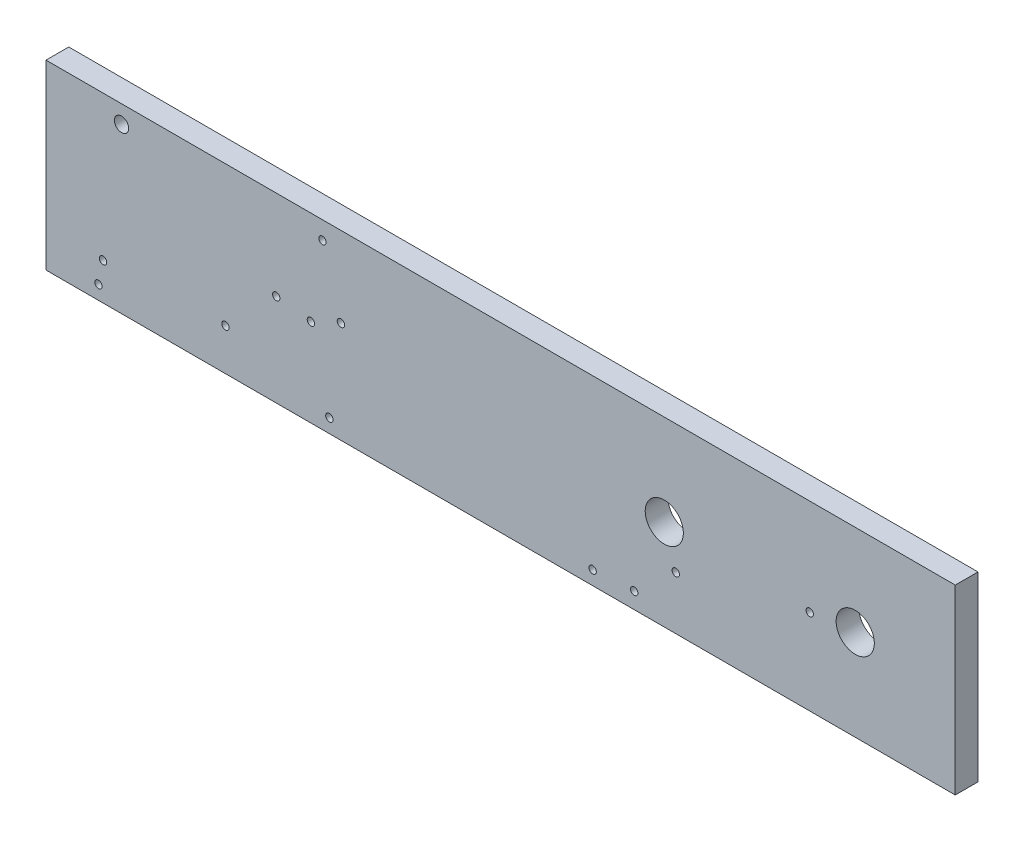
ISO-10303-21;
HEADER;
FILE_DESCRIPTION(('STEP AP214'),'2;1');
FILE_NAME('part.step','',(''),(''),'','','');
FILE_SCHEMA(('AUTOMOTIVE_DESIGN { 1 0 10303 214 1 1 1 1 }'));
ENDSEC;
DATA;
#1=APPLICATION_CONTEXT('core data for automotive mechanical design processes');
#2=APPLICATION_PROTOCOL_DEFINITION('international standard','automotive_design',2000,#1);
#3=PRODUCT_CONTEXT('',#1,'mechanical');
#4=PRODUCT('Part','Part','',(#3));
#5=PRODUCT_RELATED_PRODUCT_CATEGORY('part','',(#4));
#6=PRODUCT_DEFINITION_FORMATION('','',#4);
#7=PRODUCT_DEFINITION_CONTEXT('part definition',#1,'design');
#8=PRODUCT_DEFINITION('design','',#6,#7);
#9=PRODUCT_DEFINITION_SHAPE('','',#8);
#10=(LENGTH_UNIT() NAMED_UNIT(*) SI_UNIT(.MILLI.,.METRE.));
#11=(NAMED_UNIT(*) PLANE_ANGLE_UNIT() SI_UNIT($,.RADIAN.));
#12=(NAMED_UNIT(*) SI_UNIT($,.STERADIAN.) SOLID_ANGLE_UNIT());
#13=UNCERTAINTY_MEASURE_WITH_UNIT(LENGTH_MEASURE(1.E-05),#10,'distance_accuracy_value','');
#14=(GEOMETRIC_REPRESENTATION_CONTEXT(3) GLOBAL_UNCERTAINTY_ASSIGNED_CONTEXT((#13)) GLOBAL_UNIT_ASSIGNED_CONTEXT((#10,
#11,#12)) REPRESENTATION_CONTEXT('',''));
#15=CARTESIAN_POINT('',(0.,0.,0.));
#16=DIRECTION('',(0.,0.,1.));
#17=DIRECTION('',(1.,0.,0.));
#18=AXIS2_PLACEMENT_3D('',#15,#16,#17);
#19=CARTESIAN_POINT('',(-49.99999906,0.,1.2514072));
#20=DIRECTION('',(0.,0.,1.));
#21=DIRECTION('',(1.,0.,0.));
#22=AXIS2_PLACEMENT_3D('',#19,#20,#21);
#23=PLANE('',#22);
#24=CARTESIAN_POINT('',(-5.49999916,5.00000016,1.2514072));
#25=DIRECTION('',(0.,0.,-1.));
#26=DIRECTION('',(-1.,0.,0.));
#27=AXIS2_PLACEMENT_3D('',#24,#25,#26);
#28=CIRCLE('',#27,1.05000044);
#29=CARTESIAN_POINT('',(-6.5499996,5.00000016,1.2514072));
#30=VERTEX_POINT('',#29);
#31=EDGE_CURVE('E124',#30,#30,#28,.T.);
#32=ORIENTED_EDGE('',*,*,#31,.T.);
#33=EDGE_LOOP('',(#32));
#34=FACE_BOUND('',#33,.T.);
#35=CARTESIAN_POINT('',(-8.001,4.699,1.2514072));
#36=DIRECTION('',(0.,0.,-1.));
#37=DIRECTION('',(-1.,0.,0.));
#38=AXIS2_PLACEMENT_3D('',#35,#36,#37);
#39=CIRCLE('',#38,0.2032);
#40=CARTESIAN_POINT('',(-8.2042,4.699,1.2514072));
#41=VERTEX_POINT('',#40);
#42=EDGE_CURVE('E127',#41,#41,#39,.T.);
#43=ORIENTED_EDGE('',*,*,#42,.T.);
#44=EDGE_LOOP('',(#43));
#45=FACE_BOUND('',#44,.T.);
#46=CARTESIAN_POINT('',(-16.00000102,5.00000016,1.2514072));
#47=DIRECTION('',(0.,0.,-1.));
#48=DIRECTION('',(-1.,0.,0.));
#49=AXIS2_PLACEMENT_3D('',#46,#47,#48);
#50=CIRCLE('',#49,1.05000044);
#51=CARTESIAN_POINT('',(-17.05000146,5.00000016,1.2514072));
#52=VERTEX_POINT('',#51);
#53=EDGE_CURVE('E130',#52,#52,#50,.T.);
#54=ORIENTED_EDGE('',*,*,#53,.T.);
#55=EDGE_LOOP('',(#54));
#56=FACE_BOUND('',#55,.T.);
#57=CARTESIAN_POINT('',(-33.782,5.588,1.2514072));
#58=DIRECTION('',(0.,0.,-1.));
#59=DIRECTION('',(-1.,0.,0.));
#60=AXIS2_PLACEMENT_3D('',#57,#58,#59);
#61=CIRCLE('',#60,0.2032);
#62=CARTESIAN_POINT('',(-33.9852,5.588,1.2514072));
#63=VERTEX_POINT('',#62);
#64=EDGE_CURVE('E133',#63,#63,#61,.T.);
#65=ORIENTED_EDGE('',*,*,#64,.T.);
#66=EDGE_LOOP('',(#65));
#67=FACE_BOUND('',#66,.T.);
#68=CARTESIAN_POINT('',(-15.367,2.921,1.2514072));
#69=DIRECTION('',(0.,0.,-1.));
#70=DIRECTION('',(-1.,0.,0.));
#71=AXIS2_PLACEMENT_3D('',#68,#69,#70);
#72=CIRCLE('',#71,0.2032);
#73=CARTESIAN_POINT('',(-15.5702,2.921,1.2514072));
#74=VERTEX_POINT('',#73);
#75=EDGE_CURVE('E136',#74,#74,#72,.T.);
#76=ORIENTED_EDGE('',*,*,#75,.T.);
#77=EDGE_LOOP('',(#76));
#78=FACE_BOUND('',#77,.T.);
#79=CARTESIAN_POINT('',(-17.653,0.889,1.2514072));
#80=DIRECTION('',(0.,0.,-1.));
#81=DIRECTION('',(-1.,0.,0.));
#82=AXIS2_PLACEMENT_3D('',#79,#80,#81);
#83=CIRCLE('',#82,0.2032);
#84=CARTESIAN_POINT('',(-17.8562,0.889,1.2514072));
#85=VERTEX_POINT('',#84);
#86=EDGE_CURVE('E139',#85,#85,#83,.T.);
#87=ORIENTED_EDGE('',*,*,#86,.T.);
#88=EDGE_LOOP('',(#87));
#89=FACE_BOUND('',#88,.T.);
#90=CARTESIAN_POINT('',(-34.417,0.762,1.2514072));
#91=DIRECTION('',(0.,0.,-1.));
#92=DIRECTION('',(-1.,0.,0.));
#93=AXIS2_PLACEMENT_3D('',#90,#91,#92);
#94=CIRCLE('',#93,0.2032);
#95=CARTESIAN_POINT('',(-34.6202,0.762,1.2514072));
#96=VERTEX_POINT('',#95);
#97=EDGE_CURVE('E142',#96,#96,#94,.T.);
#98=ORIENTED_EDGE('',*,*,#97,.T.);
#99=EDGE_LOOP('',(#98));
#100=FACE_BOUND('',#99,.T.);
#101=CARTESIAN_POINT('',(-19.939,0.762,1.2514072));
#102=DIRECTION('',(0.,0.,-1.));
#103=DIRECTION('',(-1.,0.,0.));
#104=AXIS2_PLACEMENT_3D('',#101,#102,#103);
#105=CIRCLE('',#104,0.2032);
#106=CARTESIAN_POINT('',(-20.1422,0.762,1.2514072));
#107=VERTEX_POINT('',#106);
#108=EDGE_CURVE('E145',#107,#107,#105,.T.);
#109=ORIENTED_EDGE('',*,*,#108,.T.);
#110=EDGE_LOOP('',(#109));
#111=FACE_BOUND('',#110,.T.);
#112=CARTESIAN_POINT('',(-34.798,9.017,1.2514072));
#113=DIRECTION('',(0.,0.,-1.));
#114=DIRECTION('',(-1.,0.,0.));
#115=AXIS2_PLACEMENT_3D('',#112,#113,#114);
#116=CIRCLE('',#115,0.2032);
#117=CARTESIAN_POINT('',(-35.0012,9.017,1.2514072));
#118=VERTEX_POINT('',#117);
#119=EDGE_CURVE('E148',#118,#118,#116,.T.);
#120=ORIENTED_EDGE('',*,*,#119,.T.);
#121=EDGE_LOOP('',(#120));
#122=FACE_BOUND('',#121,.T.);
#123=CARTESIAN_POINT('',(-35.433,4.826,1.2514072));
#124=DIRECTION('',(0.,0.,-1.));
#125=DIRECTION('',(-1.,0.,0.));
#126=AXIS2_PLACEMENT_3D('',#123,#124,#125);
#127=CIRCLE('',#126,0.2032);
#128=CARTESIAN_POINT('',(-35.6362,4.826,1.2514072));
#129=VERTEX_POINT('',#128);
#130=EDGE_CURVE('E151',#129,#129,#127,.T.);
#131=ORIENTED_EDGE('',*,*,#130,.T.);
#132=EDGE_LOOP('',(#131));
#133=FACE_BOUND('',#132,.T.);
#134=CARTESIAN_POINT('',(-45.847,9.017,1.2514072));
#135=DIRECTION('',(0.,0.,-1.));
#136=DIRECTION('',(-1.,0.,0.));
#137=AXIS2_PLACEMENT_3D('',#134,#135,#136);
#138=CIRCLE('',#137,0.3937);
#139=CARTESIAN_POINT('',(-46.2407,9.017,1.2514072));
#140=VERTEX_POINT('',#139);
#141=EDGE_CURVE('E154',#140,#140,#138,.T.);
#142=ORIENTED_EDGE('',*,*,#141,.T.);
#143=EDGE_LOOP('',(#142));
#144=FACE_BOUND('',#143,.T.);
#145=CARTESIAN_POINT('',(-37.338,5.08,1.2514072));
#146=DIRECTION('',(0.,0.,-1.));
#147=DIRECTION('',(-1.,0.,0.));
#148=AXIS2_PLACEMENT_3D('',#145,#146,#147);
#149=CIRCLE('',#148,0.2032);
#150=CARTESIAN_POINT('',(-37.5412,5.08,1.2514072));
#151=VERTEX_POINT('',#150);
#152=EDGE_CURVE('E157',#151,#151,#149,.T.);
#153=ORIENTED_EDGE('',*,*,#152,.T.);
#154=EDGE_LOOP('',(#153));
#155=FACE_BOUND('',#154,.T.);
#156=CARTESIAN_POINT('',(-40.132,2.286,1.2514072));
#157=DIRECTION('',(0.,0.,-1.));
#158=DIRECTION('',(-1.,0.,0.));
#159=AXIS2_PLACEMENT_3D('',#156,#157,#158);
#160=CIRCLE('',#159,0.2032);
#161=CARTESIAN_POINT('',(-40.3352,2.286,1.2514072));
#162=VERTEX_POINT('',#161);
#163=EDGE_CURVE('E160',#162,#162,#160,.T.);
#164=ORIENTED_EDGE('',*,*,#163,.T.);
#165=EDGE_LOOP('',(#164));
#166=FACE_BOUND('',#165,.T.);
#167=CARTESIAN_POINT('',(-46.863,2.032,1.2514072));
#168=DIRECTION('',(0.,0.,-1.));
#169=DIRECTION('',(-1.,0.,0.));
#170=AXIS2_PLACEMENT_3D('',#167,#168,#169);
#171=CIRCLE('',#170,0.2032);
#172=CARTESIAN_POINT('',(-47.0662,2.032,1.2514072));
#173=VERTEX_POINT('',#172);
#174=EDGE_CURVE('E162',#173,#173,#171,.T.);
#175=ORIENTED_EDGE('',*,*,#174,.T.);
#176=EDGE_LOOP('',(#175));
#177=FACE_BOUND('',#176,.T.);
#178=CARTESIAN_POINT('',(-47.117,0.762,1.2514072));
#179=DIRECTION('',(0.,0.,-1.));
#180=DIRECTION('',(-1.,0.,0.));
#181=AXIS2_PLACEMENT_3D('',#178,#179,#180);
#182=CIRCLE('',#181,0.2032);
#183=CARTESIAN_POINT('',(-47.3202,0.762,1.2514072));
#184=VERTEX_POINT('',#183);
#185=EDGE_CURVE('E19',#184,#184,#182,.T.);
#186=ORIENTED_EDGE('',*,*,#185,.T.);
#187=EDGE_LOOP('',(#186));
#188=FACE_BOUND('',#187,.T.);
#189=DIRECTION('',(1.,0.,0.));
#190=VECTOR('',#189,1.);
#191=CARTESIAN_POINT('',(-49.99999906,10.00000032,1.2514072));
#192=LINE('',#191,#190);
#193=CARTESIAN_POINT('',(-49.99999906,10.00000032,1.2514072));
#194=VERTEX_POINT('',#193);
#195=CARTESIAN_POINT('',(0.,10.00000032,1.2514072));
#196=VERTEX_POINT('',#195);
#197=EDGE_CURVE('E53',#194,#196,#192,.T.);
#198=ORIENTED_EDGE('',*,*,#197,.F.);
#199=DIRECTION('',(0.,1.,0.));
#200=VECTOR('',#199,1.);
#201=CARTESIAN_POINT('',(-49.99999906,0.,1.2514072));
#202=LINE('',#201,#200);
#203=CARTESIAN_POINT('',(-49.99999906,0.,1.2514072));
#204=VERTEX_POINT('',#203);
#205=EDGE_CURVE('E70',#204,#194,#202,.T.);
#206=ORIENTED_EDGE('',*,*,#205,.F.);
#207=DIRECTION('',(1.,0.,0.));
#208=VECTOR('',#207,1.);
#209=CARTESIAN_POINT('',(0.,0.,1.2514072));
#210=LINE('',#209,#208);
#211=CARTESIAN_POINT('',(0.,0.,1.2514072));
#212=VERTEX_POINT('',#211);
#213=EDGE_CURVE('E67',#212,#204,#210,.F.);
#214=ORIENTED_EDGE('',*,*,#213,.F.);
#215=DIRECTION('',(0.,1.,0.));
#216=VECTOR('',#215,1.);
#217=CARTESIAN_POINT('',(0.,10.00000032,1.2514072));
#218=LINE('',#217,#216);
#219=EDGE_CURVE('E58',#196,#212,#218,.F.);
#220=ORIENTED_EDGE('',*,*,#219,.F.);
#221=EDGE_LOOP('',(#198,#206,#214,#220));
#222=FACE_BOUND('',#221,.T.);
#223=ADVANCED_FACE('F16',(#34,#45,#56,#67,#78,#89,#100,#111,#122,#133,#144,#155,#166,#177,#188,
#222),#23,.T.);
#224=CARTESIAN_POINT('',(0.,0.,0.));
#225=DIRECTION('',(0.,-1.,0.));
#226=DIRECTION('',(0.,0.,-1.));
#227=AXIS2_PLACEMENT_3D('',#224,#225,#226);
#228=PLANE('',#227);
#229=DIRECTION('',(0.,0.,1.));
#230=VECTOR('',#229,1.);
#231=CARTESIAN_POINT('',(-49.99999906,0.,0.));
#232=LINE('',#231,#230);
#233=CARTESIAN_POINT('',(-49.99999906,0.,0.));
#234=VERTEX_POINT('',#233);
#235=EDGE_CURVE('E170',#234,#204,#232,.T.);
#236=ORIENTED_EDGE('',*,*,#235,.F.);
#237=DIRECTION('',(1.,0.,0.));
#238=VECTOR('',#237,1.);
#239=CARTESIAN_POINT('',(-49.99999906,0.,0.));
#240=LINE('',#239,#238);
#241=CARTESIAN_POINT('',(0.,0.,0.));
#242=VERTEX_POINT('',#241);
#243=EDGE_CURVE('E77',#234,#242,#240,.T.);
#244=ORIENTED_EDGE('',*,*,#243,.T.);
#245=DIRECTION('',(0.,0.,-1.));
#246=VECTOR('',#245,1.);
#247=CARTESIAN_POINT('',(0.,0.,0.));
#248=LINE('',#247,#246);
#249=EDGE_CURVE('E63',#212,#242,#248,.T.);
#250=ORIENTED_EDGE('',*,*,#249,.F.);
#251=ORIENTED_EDGE('',*,*,#213,.T.);
#252=EDGE_LOOP('',(#236,#244,#250,#251));
#253=FACE_BOUND('',#252,.T.);
#254=ADVANCED_FACE('F76',(#253),#228,.T.);
#255=CARTESIAN_POINT('',(0.,10.00000032,0.));
#256=DIRECTION('',(1.,0.,0.));
#257=DIRECTION('',(0.,0.,-1.));
#258=AXIS2_PLACEMENT_3D('',#255,#256,#257);
#259=PLANE('',#258);
#260=ORIENTED_EDGE('',*,*,#249,.T.);
#261=DIRECTION('',(0.,1.,0.));
#262=VECTOR('',#261,1.);
#263=CARTESIAN_POINT('',(0.,0.,0.));
#264=LINE('',#263,#262);
#265=CARTESIAN_POINT('',(0.,10.00000032,0.));
#266=VERTEX_POINT('',#265);
#267=EDGE_CURVE('E181',#242,#266,#264,.T.);
#268=ORIENTED_EDGE('',*,*,#267,.T.);
#269=DIRECTION('',(0.,0.,1.));
#270=VECTOR('',#269,1.);
#271=CARTESIAN_POINT('',(0.,10.00000032,0.));
#272=LINE('',#271,#270);
#273=EDGE_CURVE('E65',#196,#266,#272,.F.);
#274=ORIENTED_EDGE('',*,*,#273,.F.);
#275=ORIENTED_EDGE('',*,*,#219,.T.);
#276=EDGE_LOOP('',(#260,#268,#274,#275));
#277=FACE_BOUND('',#276,.T.);
#278=ADVANCED_FACE('F60',(#277),#259,.T.);
#279=CARTESIAN_POINT('',(-49.99999906,10.00000032,0.));
#280=DIRECTION('',(0.,1.,0.));
#281=DIRECTION('',(0.,0.,1.));
#282=AXIS2_PLACEMENT_3D('',#279,#280,#281);
#283=PLANE('',#282);
#284=ORIENTED_EDGE('',*,*,#273,.T.);
#285=DIRECTION('',(1.,0.,0.));
#286=VECTOR('',#285,1.);
#287=CARTESIAN_POINT('',(-49.99999906,10.00000032,0.));
#288=LINE('',#287,#286);
#289=CARTESIAN_POINT('',(-49.99999906,10.00000032,0.));
#290=VERTEX_POINT('',#289);
#291=EDGE_CURVE('E178',#266,#290,#288,.F.);
#292=ORIENTED_EDGE('',*,*,#291,.T.);
#293=DIRECTION('',(0.,0.,1.));
#294=VECTOR('',#293,1.);
#295=CARTESIAN_POINT('',(-49.99999906,10.00000032,0.));
#296=LINE('',#295,#294);
#297=EDGE_CURVE('E34',#194,#290,#296,.F.);
#298=ORIENTED_EDGE('',*,*,#297,.F.);
#299=ORIENTED_EDGE('',*,*,#197,.T.);
#300=EDGE_LOOP('',(#284,#292,#298,#299));
#301=FACE_BOUND('',#300,.T.);
#302=ADVANCED_FACE('F177',(#301),#283,.T.);
#303=CARTESIAN_POINT('',(-49.99999906,0.,0.));
#304=DIRECTION('',(-1.,0.,0.));
#305=DIRECTION('',(0.,0.,1.));
#306=AXIS2_PLACEMENT_3D('',#303,#304,#305);
#307=PLANE('',#306);
#308=ORIENTED_EDGE('',*,*,#297,.T.);
#309=DIRECTION('',(0.,1.,0.));
#310=VECTOR('',#309,1.);
#311=CARTESIAN_POINT('',(-49.99999906,0.,0.));
#312=LINE('',#311,#310);
#313=EDGE_CURVE('E123',#290,#234,#312,.F.);
#314=ORIENTED_EDGE('',*,*,#313,.T.);
#315=ORIENTED_EDGE('',*,*,#235,.T.);
#316=ORIENTED_EDGE('',*,*,#205,.T.);
#317=EDGE_LOOP('',(#308,#314,#315,#316));
#318=FACE_BOUND('',#317,.T.);
#319=ADVANCED_FACE('F184',(#318),#307,.T.);
#320=CARTESIAN_POINT('',(-47.117,0.762,0.));
#321=DIRECTION('',(0.,0.,-1.));
#322=DIRECTION('',(-1.,0.,0.));
#323=AXIS2_PLACEMENT_3D('',#320,#321,#322);
#324=CYLINDRICAL_SURFACE('',#323,0.2032);
#325=ORIENTED_EDGE('',*,*,#185,.F.);
#326=EDGE_LOOP('',(#325));
#327=FACE_BOUND('',#326,.T.);
#328=CARTESIAN_POINT('',(-47.117,0.762,0.));
#329=DIRECTION('',(0.,0.,-1.));
#330=DIRECTION('',(-1.,0.,0.));
#331=AXIS2_PLACEMENT_3D('',#328,#329,#330);
#332=CIRCLE('',#331,0.2032);
#333=CARTESIAN_POINT('',(-47.3202,0.762,0.));
#334=VERTEX_POINT('',#333);
#335=EDGE_CURVE('E120',#334,#334,#332,.T.);
#336=ORIENTED_EDGE('',*,*,#335,.T.);
#337=EDGE_LOOP('',(#336));
#338=FACE_BOUND('',#337,.T.);
#339=ADVANCED_FACE('F186',(#327,#338),#324,.F.);
#340=CARTESIAN_POINT('',(-46.863,2.032,0.));
#341=DIRECTION('',(0.,0.,-1.));
#342=DIRECTION('',(-1.,0.,0.));
#343=AXIS2_PLACEMENT_3D('',#340,#341,#342);
#344=CYLINDRICAL_SURFACE('',#343,0.2032);
#345=ORIENTED_EDGE('',*,*,#174,.F.);
#346=EDGE_LOOP('',(#345));
#347=FACE_BOUND('',#346,.T.);
#348=CARTESIAN_POINT('',(-46.863,2.032,0.));
#349=DIRECTION('',(0.,0.,-1.));
#350=DIRECTION('',(-1.,0.,0.));
#351=AXIS2_PLACEMENT_3D('',#348,#349,#350);
#352=CIRCLE('',#351,0.2032);
#353=CARTESIAN_POINT('',(-47.0662,2.032,0.));
#354=VERTEX_POINT('',#353);
#355=EDGE_CURVE('E117',#354,#354,#352,.T.);
#356=ORIENTED_EDGE('',*,*,#355,.T.);
#357=EDGE_LOOP('',(#356));
#358=FACE_BOUND('',#357,.T.);
#359=ADVANCED_FACE('F193',(#347,#358),#344,.F.);
#360=CARTESIAN_POINT('',(-40.132,2.286,0.));
#361=DIRECTION('',(0.,0.,-1.));
#362=DIRECTION('',(-1.,0.,0.));
#363=AXIS2_PLACEMENT_3D('',#360,#361,#362);
#364=CYLINDRICAL_SURFACE('',#363,0.2032);
#365=ORIENTED_EDGE('',*,*,#163,.F.);
#366=EDGE_LOOP('',(#365));
#367=FACE_BOUND('',#366,.T.);
#368=CARTESIAN_POINT('',(-40.132,2.286,0.));
#369=DIRECTION('',(0.,0.,-1.));
#370=DIRECTION('',(-1.,0.,0.));
#371=AXIS2_PLACEMENT_3D('',#368,#369,#370);
#372=CIRCLE('',#371,0.2032);
#373=CARTESIAN_POINT('',(-40.3352,2.286,0.));
#374=VERTEX_POINT('',#373);
#375=EDGE_CURVE('E114',#374,#374,#372,.T.);
#376=ORIENTED_EDGE('',*,*,#375,.T.);
#377=EDGE_LOOP('',(#376));
#378=FACE_BOUND('',#377,.T.);
#379=ADVANCED_FACE('F252',(#367,#378),#364,.F.);
#380=CARTESIAN_POINT('',(-37.338,5.08,0.));
#381=DIRECTION('',(0.,0.,-1.));
#382=DIRECTION('',(-1.,0.,0.));
#383=AXIS2_PLACEMENT_3D('',#380,#381,#382);
#384=CYLINDRICAL_SURFACE('',#383,0.2032);
#385=ORIENTED_EDGE('',*,*,#152,.F.);
#386=EDGE_LOOP('',(#385));
#387=FACE_BOUND('',#386,.T.);
#388=CARTESIAN_POINT('',(-37.338,5.08,0.));
#389=DIRECTION('',(0.,0.,-1.));
#390=DIRECTION('',(-1.,0.,0.));
#391=AXIS2_PLACEMENT_3D('',#388,#389,#390);
#392=CIRCLE('',#391,0.2032);
#393=CARTESIAN_POINT('',(-37.5412,5.08,0.));
#394=VERTEX_POINT('',#393);
#395=EDGE_CURVE('E111',#394,#394,#392,.T.);
#396=ORIENTED_EDGE('',*,*,#395,.T.);
#397=EDGE_LOOP('',(#396));
#398=FACE_BOUND('',#397,.T.);
#399=ADVANCED_FACE('F248',(#387,#398),#384,.F.);
#400=CARTESIAN_POINT('',(-45.847,9.017,0.));
#401=DIRECTION('',(0.,0.,-1.));
#402=DIRECTION('',(-1.,0.,0.));
#403=AXIS2_PLACEMENT_3D('',#400,#401,#402);
#404=CYLINDRICAL_SURFACE('',#403,0.3937);
#405=ORIENTED_EDGE('',*,*,#141,.F.);
#406=EDGE_LOOP('',(#405));
#407=FACE_BOUND('',#406,.T.);
#408=CARTESIAN_POINT('',(-45.847,9.017,0.));
#409=DIRECTION('',(0.,0.,-1.));
#410=DIRECTION('',(-1.,0.,0.));
#411=AXIS2_PLACEMENT_3D('',#408,#409,#410);
#412=CIRCLE('',#411,0.3937);
#413=CARTESIAN_POINT('',(-46.2407,9.017,0.));
#414=VERTEX_POINT('',#413);
#415=EDGE_CURVE('E108',#414,#414,#412,.T.);
#416=ORIENTED_EDGE('',*,*,#415,.T.);
#417=EDGE_LOOP('',(#416));
#418=FACE_BOUND('',#417,.T.);
#419=ADVANCED_FACE('F244',(#407,#418),#404,.F.);
#420=CARTESIAN_POINT('',(-35.433,4.826,0.));
#421=DIRECTION('',(0.,0.,-1.));
#422=DIRECTION('',(-1.,0.,0.));
#423=AXIS2_PLACEMENT_3D('',#420,#421,#422);
#424=CYLINDRICAL_SURFACE('',#423,0.2032);
#425=ORIENTED_EDGE('',*,*,#130,.F.);
#426=EDGE_LOOP('',(#425));
#427=FACE_BOUND('',#426,.T.);
#428=CARTESIAN_POINT('',(-35.433,4.826,0.));
#429=DIRECTION('',(0.,0.,-1.));
#430=DIRECTION('',(-1.,0.,0.));
#431=AXIS2_PLACEMENT_3D('',#428,#429,#430);
#432=CIRCLE('',#431,0.2032);
#433=CARTESIAN_POINT('',(-35.6362,4.826,0.));
#434=VERTEX_POINT('',#433);
#435=EDGE_CURVE('E105',#434,#434,#432,.T.);
#436=ORIENTED_EDGE('',*,*,#435,.T.);
#437=EDGE_LOOP('',(#436));
#438=FACE_BOUND('',#437,.T.);
#439=ADVANCED_FACE('F240',(#427,#438),#424,.F.);
#440=CARTESIAN_POINT('',(-34.798,9.017,0.));
#441=DIRECTION('',(0.,0.,-1.));
#442=DIRECTION('',(-1.,0.,0.));
#443=AXIS2_PLACEMENT_3D('',#440,#441,#442);
#444=CYLINDRICAL_SURFACE('',#443,0.2032);
#445=ORIENTED_EDGE('',*,*,#119,.F.);
#446=EDGE_LOOP('',(#445));
#447=FACE_BOUND('',#446,.T.);
#448=CARTESIAN_POINT('',(-34.798,9.017,0.));
#449=DIRECTION('',(0.,0.,-1.));
#450=DIRECTION('',(-1.,0.,0.));
#451=AXIS2_PLACEMENT_3D('',#448,#449,#450);
#452=CIRCLE('',#451,0.2032);
#453=CARTESIAN_POINT('',(-35.0012,9.017,0.));
#454=VERTEX_POINT('',#453);
#455=EDGE_CURVE('E102',#454,#454,#452,.T.);
#456=ORIENTED_EDGE('',*,*,#455,.T.);
#457=EDGE_LOOP('',(#456));
#458=FACE_BOUND('',#457,.T.);
#459=ADVANCED_FACE('F236',(#447,#458),#444,.F.);
#460=CARTESIAN_POINT('',(-19.939,0.762,0.));
#461=DIRECTION('',(0.,0.,-1.));
#462=DIRECTION('',(-1.,0.,0.));
#463=AXIS2_PLACEMENT_3D('',#460,#461,#462);
#464=CYLINDRICAL_SURFACE('',#463,0.2032);
#465=ORIENTED_EDGE('',*,*,#108,.F.);
#466=EDGE_LOOP('',(#465));
#467=FACE_BOUND('',#466,.T.);
#468=CARTESIAN_POINT('',(-19.939,0.762,0.));
#469=DIRECTION('',(0.,0.,-1.));
#470=DIRECTION('',(-1.,0.,0.));
#471=AXIS2_PLACEMENT_3D('',#468,#469,#470);
#472=CIRCLE('',#471,0.2032);
#473=CARTESIAN_POINT('',(-20.1422,0.762,0.));
#474=VERTEX_POINT('',#473);
#475=EDGE_CURVE('E99',#474,#474,#472,.T.);
#476=ORIENTED_EDGE('',*,*,#475,.T.);
#477=EDGE_LOOP('',(#476));
#478=FACE_BOUND('',#477,.T.);
#479=ADVANCED_FACE('F232',(#467,#478),#464,.F.);
#480=CARTESIAN_POINT('',(-34.417,0.762,0.));
#481=DIRECTION('',(0.,0.,-1.));
#482=DIRECTION('',(-1.,0.,0.));
#483=AXIS2_PLACEMENT_3D('',#480,#481,#482);
#484=CYLINDRICAL_SURFACE('',#483,0.2032);
#485=ORIENTED_EDGE('',*,*,#97,.F.);
#486=EDGE_LOOP('',(#485));
#487=FACE_BOUND('',#486,.T.);
#488=CARTESIAN_POINT('',(-34.417,0.762,0.));
#489=DIRECTION('',(0.,0.,-1.));
#490=DIRECTION('',(-1.,0.,0.));
#491=AXIS2_PLACEMENT_3D('',#488,#489,#490);
#492=CIRCLE('',#491,0.2032);
#493=CARTESIAN_POINT('',(-34.6202,0.762,0.));
#494=VERTEX_POINT('',#493);
#495=EDGE_CURVE('E96',#494,#494,#492,.T.);
#496=ORIENTED_EDGE('',*,*,#495,.T.);
#497=EDGE_LOOP('',(#496));
#498=FACE_BOUND('',#497,.T.);
#499=ADVANCED_FACE('F228',(#487,#498),#484,.F.);
#500=CARTESIAN_POINT('',(-17.653,0.889,0.));
#501=DIRECTION('',(0.,0.,-1.));
#502=DIRECTION('',(-1.,0.,0.));
#503=AXIS2_PLACEMENT_3D('',#500,#501,#502);
#504=CYLINDRICAL_SURFACE('',#503,0.2032);
#505=ORIENTED_EDGE('',*,*,#86,.F.);
#506=EDGE_LOOP('',(#505));
#507=FACE_BOUND('',#506,.T.);
#508=CARTESIAN_POINT('',(-17.653,0.889,0.));
#509=DIRECTION('',(0.,0.,-1.));
#510=DIRECTION('',(-1.,0.,0.));
#511=AXIS2_PLACEMENT_3D('',#508,#509,#510);
#512=CIRCLE('',#511,0.2032);
#513=CARTESIAN_POINT('',(-17.8562,0.889,0.));
#514=VERTEX_POINT('',#513);
#515=EDGE_CURVE('E93',#514,#514,#512,.T.);
#516=ORIENTED_EDGE('',*,*,#515,.T.);
#517=EDGE_LOOP('',(#516));
#518=FACE_BOUND('',#517,.T.);
#519=ADVANCED_FACE('F224',(#507,#518),#504,.F.);
#520=CARTESIAN_POINT('',(-15.367,2.921,0.));
#521=DIRECTION('',(0.,0.,-1.));
#522=DIRECTION('',(-1.,0.,0.));
#523=AXIS2_PLACEMENT_3D('',#520,#521,#522);
#524=CYLINDRICAL_SURFACE('',#523,0.2032);
#525=ORIENTED_EDGE('',*,*,#75,.F.);
#526=EDGE_LOOP('',(#525));
#527=FACE_BOUND('',#526,.T.);
#528=CARTESIAN_POINT('',(-15.367,2.921,0.));
#529=DIRECTION('',(0.,0.,-1.));
#530=DIRECTION('',(-1.,0.,0.));
#531=AXIS2_PLACEMENT_3D('',#528,#529,#530);
#532=CIRCLE('',#531,0.2032);
#533=CARTESIAN_POINT('',(-15.5702,2.921,0.));
#534=VERTEX_POINT('',#533);
#535=EDGE_CURVE('E90',#534,#534,#532,.T.);
#536=ORIENTED_EDGE('',*,*,#535,.T.);
#537=EDGE_LOOP('',(#536));
#538=FACE_BOUND('',#537,.T.);
#539=ADVANCED_FACE('F220',(#527,#538),#524,.F.);
#540=CARTESIAN_POINT('',(-33.782,5.588,0.));
#541=DIRECTION('',(0.,0.,-1.));
#542=DIRECTION('',(-1.,0.,0.));
#543=AXIS2_PLACEMENT_3D('',#540,#541,#542);
#544=CYLINDRICAL_SURFACE('',#543,0.2032);
#545=ORIENTED_EDGE('',*,*,#64,.F.);
#546=EDGE_LOOP('',(#545));
#547=FACE_BOUND('',#546,.T.);
#548=CARTESIAN_POINT('',(-33.782,5.588,0.));
#549=DIRECTION('',(0.,0.,-1.));
#550=DIRECTION('',(-1.,0.,0.));
#551=AXIS2_PLACEMENT_3D('',#548,#549,#550);
#552=CIRCLE('',#551,0.2032);
#553=CARTESIAN_POINT('',(-33.9852,5.588,0.));
#554=VERTEX_POINT('',#553);
#555=EDGE_CURVE('E87',#554,#554,#552,.T.);
#556=ORIENTED_EDGE('',*,*,#555,.T.);
#557=EDGE_LOOP('',(#556));
#558=FACE_BOUND('',#557,.T.);
#559=ADVANCED_FACE('F216',(#547,#558),#544,.F.);
#560=CARTESIAN_POINT('',(-16.00000102,5.00000016,0.));
#561=DIRECTION('',(0.,0.,-1.));
#562=DIRECTION('',(-1.,0.,0.));
#563=AXIS2_PLACEMENT_3D('',#560,#561,#562);
#564=CYLINDRICAL_SURFACE('',#563,1.05000044);
#565=ORIENTED_EDGE('',*,*,#53,.F.);
#566=EDGE_LOOP('',(#565));
#567=FACE_BOUND('',#566,.T.);
#568=CARTESIAN_POINT('',(-16.00000102,5.00000016,0.));
#569=DIRECTION('',(0.,0.,-1.));
#570=DIRECTION('',(-1.,0.,0.));
#571=AXIS2_PLACEMENT_3D('',#568,#569,#570);
#572=CIRCLE('',#571,1.05000044);
#573=CARTESIAN_POINT('',(-17.05000146,5.00000016,0.));
#574=VERTEX_POINT('',#573);
#575=EDGE_CURVE('E84',#574,#574,#572,.T.);
#576=ORIENTED_EDGE('',*,*,#575,.T.);
#577=EDGE_LOOP('',(#576));
#578=FACE_BOUND('',#577,.T.);
#579=ADVANCED_FACE('F212',(#567,#578),#564,.F.);
#580=CARTESIAN_POINT('',(-8.001,4.699,0.));
#581=DIRECTION('',(0.,0.,-1.));
#582=DIRECTION('',(-1.,0.,0.));
#583=AXIS2_PLACEMENT_3D('',#580,#581,#582);
#584=CYLINDRICAL_SURFACE('',#583,0.2032);
#585=ORIENTED_EDGE('',*,*,#42,.F.);
#586=EDGE_LOOP('',(#585));
#587=FACE_BOUND('',#586,.T.);
#588=CARTESIAN_POINT('',(-8.001,4.699,0.));
#589=DIRECTION('',(0.,0.,-1.));
#590=DIRECTION('',(-1.,0.,0.));
#591=AXIS2_PLACEMENT_3D('',#588,#589,#590);
#592=CIRCLE('',#591,0.2032);
#593=CARTESIAN_POINT('',(-8.2042,4.699,0.));
#594=VERTEX_POINT('',#593);
#595=EDGE_CURVE('E25',#594,#594,#592,.T.);
#596=ORIENTED_EDGE('',*,*,#595,.T.);
#597=EDGE_LOOP('',(#596));
#598=FACE_BOUND('',#597,.T.);
#599=ADVANCED_FACE('F204',(#587,#598),#584,.F.);
#600=CARTESIAN_POINT('',(-5.49999916,5.00000016,0.));
#601=DIRECTION('',(0.,0.,-1.));
#602=DIRECTION('',(-1.,0.,0.));
#603=AXIS2_PLACEMENT_3D('',#600,#601,#602);
#604=CYLINDRICAL_SURFACE('',#603,1.05000044);
#605=ORIENTED_EDGE('',*,*,#31,.F.);
#606=EDGE_LOOP('',(#605));
#607=FACE_BOUND('',#606,.T.);
#608=CARTESIAN_POINT('',(-5.49999916,5.00000016,0.));
#609=DIRECTION('',(0.,0.,-1.));
#610=DIRECTION('',(-1.,0.,0.));
#611=AXIS2_PLACEMENT_3D('',#608,#609,#610);
#612=CIRCLE('',#611,1.05000044);
#613=CARTESIAN_POINT('',(-6.5499996,5.00000016,0.));
#614=VERTEX_POINT('',#613);
#615=EDGE_CURVE('E11',#614,#614,#612,.T.);
#616=ORIENTED_EDGE('',*,*,#615,.T.);
#617=EDGE_LOOP('',(#616));
#618=FACE_BOUND('',#617,.T.);
#619=ADVANCED_FACE('F198',(#607,#618),#604,.F.);
#620=CARTESIAN_POINT('',(-49.99999906,0.,0.));
#621=DIRECTION('',(0.,0.,1.));
#622=DIRECTION('',(1.,0.,0.));
#623=AXIS2_PLACEMENT_3D('',#620,#621,#622);
#624=PLANE('',#623);
#625=ORIENTED_EDGE('',*,*,#615,.F.);
#626=EDGE_LOOP('',(#625));
#627=FACE_BOUND('',#626,.T.);
#628=ORIENTED_EDGE('',*,*,#595,.F.);
#629=EDGE_LOOP('',(#628));
#630=FACE_BOUND('',#629,.T.);
#631=ORIENTED_EDGE('',*,*,#575,.F.);
#632=EDGE_LOOP('',(#631));
#633=FACE_BOUND('',#632,.T.);
#634=ORIENTED_EDGE('',*,*,#555,.F.);
#635=EDGE_LOOP('',(#634));
#636=FACE_BOUND('',#635,.T.);
#637=ORIENTED_EDGE('',*,*,#535,.F.);
#638=EDGE_LOOP('',(#637));
#639=FACE_BOUND('',#638,.T.);
#640=ORIENTED_EDGE('',*,*,#515,.F.);
#641=EDGE_LOOP('',(#640));
#642=FACE_BOUND('',#641,.T.);
#643=ORIENTED_EDGE('',*,*,#495,.F.);
#644=EDGE_LOOP('',(#643));
#645=FACE_BOUND('',#644,.T.);
#646=ORIENTED_EDGE('',*,*,#475,.F.);
#647=EDGE_LOOP('',(#646));
#648=FACE_BOUND('',#647,.T.);
#649=ORIENTED_EDGE('',*,*,#455,.F.);
#650=EDGE_LOOP('',(#649));
#651=FACE_BOUND('',#650,.T.);
#652=ORIENTED_EDGE('',*,*,#435,.F.);
#653=EDGE_LOOP('',(#652));
#654=FACE_BOUND('',#653,.T.);
#655=ORIENTED_EDGE('',*,*,#415,.F.);
#656=EDGE_LOOP('',(#655));
#657=FACE_BOUND('',#656,.T.);
#658=ORIENTED_EDGE('',*,*,#395,.F.);
#659=EDGE_LOOP('',(#658));
#660=FACE_BOUND('',#659,.T.);
#661=ORIENTED_EDGE('',*,*,#375,.F.);
#662=EDGE_LOOP('',(#661));
#663=FACE_BOUND('',#662,.T.);
#664=ORIENTED_EDGE('',*,*,#355,.F.);
#665=EDGE_LOOP('',(#664));
#666=FACE_BOUND('',#665,.T.);
#667=ORIENTED_EDGE('',*,*,#335,.F.);
#668=EDGE_LOOP('',(#667));
#669=FACE_BOUND('',#668,.T.);
#670=ORIENTED_EDGE('',*,*,#291,.F.);
#671=ORIENTED_EDGE('',*,*,#267,.F.);
#672=ORIENTED_EDGE('',*,*,#243,.F.);
#673=ORIENTED_EDGE('',*,*,#313,.F.);
#674=EDGE_LOOP('',(#670,#671,#672,#673));
#675=FACE_BOUND('',#674,.T.);
#676=ADVANCED_FACE('F180',(#627,#630,#633,#636,#639,#642,#645,#648,#651,#654,#657,#660,#663,
#666,#669,#675),#624,.F.);
#677=CLOSED_SHELL('',(#223,#254,#278,#302,#319,#339,#359,#379,#399,#419,#439,#459,#479,#499,
#519,#539,#559,#579,#599,#619,#676));
#678=MANIFOLD_SOLID_BREP('B1',#677);
#679=ADVANCED_BREP_SHAPE_REPRESENTATION('',(#18,#678),#14);
#680=SHAPE_DEFINITION_REPRESENTATION(#9,#679);
ENDSEC;
END-ISO-10303-21;
